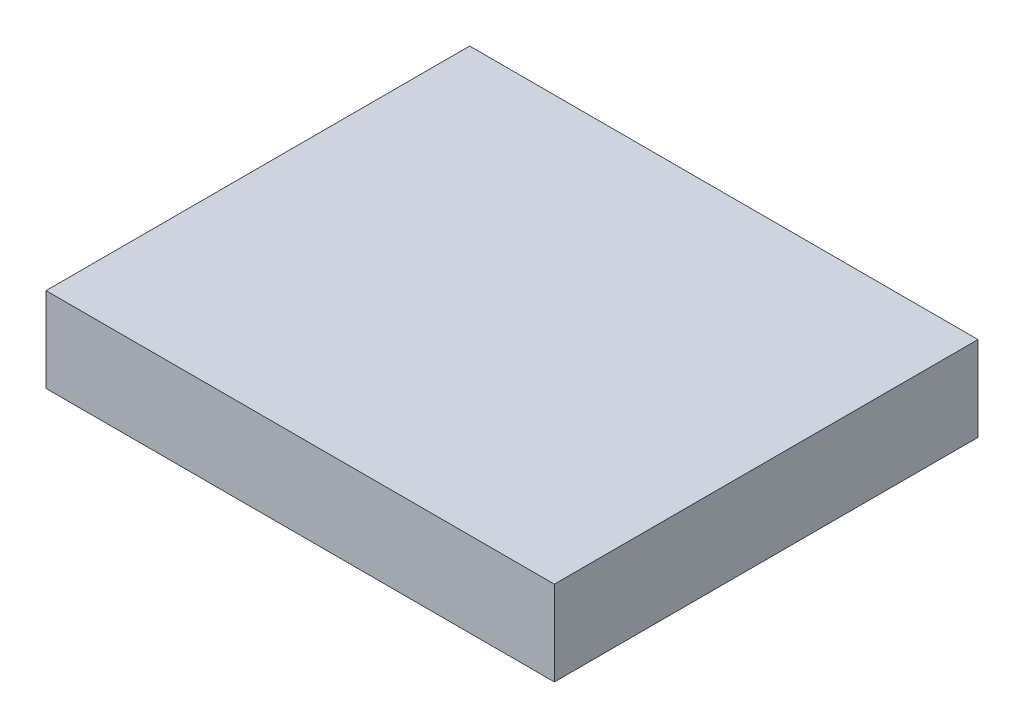
ISO-10303-21;
HEADER;
FILE_DESCRIPTION(('STEP AP214'),'2;1');
FILE_NAME('part.step','',(''),(''),'','','');
FILE_SCHEMA(('AUTOMOTIVE_DESIGN { 1 0 10303 214 1 1 1 1 }'));
ENDSEC;
DATA;
#1=APPLICATION_CONTEXT('core data for automotive mechanical design processes');
#2=APPLICATION_PROTOCOL_DEFINITION('international standard','automotive_design',2000,#1);
#3=PRODUCT_CONTEXT('',#1,'mechanical');
#4=PRODUCT('Part','Part','',(#3));
#5=PRODUCT_RELATED_PRODUCT_CATEGORY('part','',(#4));
#6=PRODUCT_DEFINITION_FORMATION('','',#4);
#7=PRODUCT_DEFINITION_CONTEXT('part definition',#1,'design');
#8=PRODUCT_DEFINITION('design','',#6,#7);
#9=PRODUCT_DEFINITION_SHAPE('','',#8);
#10=(LENGTH_UNIT() NAMED_UNIT(*) SI_UNIT(.MILLI.,.METRE.));
#11=(NAMED_UNIT(*) PLANE_ANGLE_UNIT() SI_UNIT($,.RADIAN.));
#12=(NAMED_UNIT(*) SI_UNIT($,.STERADIAN.) SOLID_ANGLE_UNIT());
#13=UNCERTAINTY_MEASURE_WITH_UNIT(LENGTH_MEASURE(1.E-05),#10,'distance_accuracy_value','');
#14=(GEOMETRIC_REPRESENTATION_CONTEXT(3) GLOBAL_UNCERTAINTY_ASSIGNED_CONTEXT((#13)) GLOBAL_UNIT_ASSIGNED_CONTEXT((#10,
#11,#12)) REPRESENTATION_CONTEXT('',''));
#15=CARTESIAN_POINT('',(0.,0.,0.));
#16=DIRECTION('',(0.,0.,1.));
#17=DIRECTION('',(1.,0.,0.));
#18=AXIS2_PLACEMENT_3D('',#15,#16,#17);
#19=CARTESIAN_POINT('',(0.,5.,0.));
#20=DIRECTION('',(1.,0.,0.));
#21=DIRECTION('',(0.,0.,-1.));
#22=AXIS2_PLACEMENT_3D('',#19,#20,#21);
#23=PLANE('',#22);
#24=DIRECTION('',(0.,0.,1.));
#25=VECTOR('',#24,1.);
#26=CARTESIAN_POINT('',(0.,0.,0.));
#27=LINE('',#26,#25);
#28=CARTESIAN_POINT('',(0.,0.,-25.));
#29=VERTEX_POINT('',#28);
#30=CARTESIAN_POINT('',(0.,0.,0.));
#31=VERTEX_POINT('',#30);
#32=EDGE_CURVE('E99',#29,#31,#27,.T.);
#33=ORIENTED_EDGE('',*,*,#32,.T.);
#34=DIRECTION('',(0.,-1.,0.));
#35=VECTOR('',#34,1.);
#36=CARTESIAN_POINT('',(0.,5.,0.));
#37=LINE('',#36,#35);
#38=CARTESIAN_POINT('',(0.,5.,0.));
#39=VERTEX_POINT('',#38);
#40=EDGE_CURVE('E11',#39,#31,#37,.T.);
#41=ORIENTED_EDGE('',*,*,#40,.F.);
#42=DIRECTION('',(0.,0.,1.));
#43=VECTOR('',#42,1.);
#44=CARTESIAN_POINT('',(0.,5.,0.));
#45=LINE('',#44,#43);
#46=CARTESIAN_POINT('',(0.,5.,-25.));
#47=VERTEX_POINT('',#46);
#48=EDGE_CURVE('E87',#47,#39,#45,.T.);
#49=ORIENTED_EDGE('',*,*,#48,.F.);
#50=DIRECTION('',(0.,-1.,0.));
#51=VECTOR('',#50,1.);
#52=CARTESIAN_POINT('',(0.,5.,-25.));
#53=LINE('',#52,#51);
#54=EDGE_CURVE('E95',#47,#29,#53,.T.);
#55=ORIENTED_EDGE('',*,*,#54,.T.);
#56=EDGE_LOOP('',(#33,#41,#49,#55));
#57=FACE_BOUND('',#56,.T.);
#58=ADVANCED_FACE('F36',(#57),#23,.F.);
#59=CARTESIAN_POINT('',(0.,5.,0.));
#60=DIRECTION('',(0.,0.,-1.));
#61=DIRECTION('',(-1.,0.,0.));
#62=AXIS2_PLACEMENT_3D('',#59,#60,#61);
#63=PLANE('',#62);
#64=DIRECTION('',(1.,0.,0.));
#65=VECTOR('',#64,1.);
#66=CARTESIAN_POINT('',(0.,0.,0.));
#67=LINE('',#66,#65);
#68=CARTESIAN_POINT('',(30.,0.,0.));
#69=VERTEX_POINT('',#68);
#70=EDGE_CURVE('E91',#31,#69,#67,.T.);
#71=ORIENTED_EDGE('',*,*,#70,.T.);
#72=DIRECTION('',(0.,-1.,0.));
#73=VECTOR('',#72,1.);
#74=CARTESIAN_POINT('',(30.,5.,0.));
#75=LINE('',#74,#73);
#76=CARTESIAN_POINT('',(30.,5.,0.));
#77=VERTEX_POINT('',#76);
#78=EDGE_CURVE('E44',#77,#69,#75,.T.);
#79=ORIENTED_EDGE('',*,*,#78,.F.);
#80=DIRECTION('',(1.,0.,0.));
#81=VECTOR('',#80,1.);
#82=CARTESIAN_POINT('',(0.,5.,0.));
#83=LINE('',#82,#81);
#84=EDGE_CURVE('E82',#39,#77,#83,.T.);
#85=ORIENTED_EDGE('',*,*,#84,.F.);
#86=ORIENTED_EDGE('',*,*,#40,.T.);
#87=EDGE_LOOP('',(#71,#79,#85,#86));
#88=FACE_BOUND('',#87,.T.);
#89=ADVANCED_FACE('F90',(#88),#63,.F.);
#90=CARTESIAN_POINT('',(30.,5.,0.));
#91=DIRECTION('',(-1.,0.,0.));
#92=DIRECTION('',(0.,0.,1.));
#93=AXIS2_PLACEMENT_3D('',#90,#91,#92);
#94=PLANE('',#93);
#95=DIRECTION('',(0.,0.,-1.));
#96=VECTOR('',#95,1.);
#97=CARTESIAN_POINT('',(30.,0.,0.));
#98=LINE('',#97,#96);
#99=CARTESIAN_POINT('',(30.,0.,-25.));
#100=VERTEX_POINT('',#99);
#101=EDGE_CURVE('E69',#69,#100,#98,.T.);
#102=ORIENTED_EDGE('',*,*,#101,.T.);
#103=DIRECTION('',(0.,-1.,0.));
#104=VECTOR('',#103,1.);
#105=CARTESIAN_POINT('',(30.,5.,-25.));
#106=LINE('',#105,#104);
#107=CARTESIAN_POINT('',(30.,5.,-25.));
#108=VERTEX_POINT('',#107);
#109=EDGE_CURVE('E92',#108,#100,#106,.T.);
#110=ORIENTED_EDGE('',*,*,#109,.F.);
#111=DIRECTION('',(0.,0.,-1.));
#112=VECTOR('',#111,1.);
#113=CARTESIAN_POINT('',(30.,5.,0.));
#114=LINE('',#113,#112);
#115=EDGE_CURVE('E85',#77,#108,#114,.T.);
#116=ORIENTED_EDGE('',*,*,#115,.F.);
#117=ORIENTED_EDGE('',*,*,#78,.T.);
#118=EDGE_LOOP('',(#102,#110,#116,#117));
#119=FACE_BOUND('',#118,.T.);
#120=ADVANCED_FACE('F93',(#119),#94,.F.);
#121=CARTESIAN_POINT('',(0.,5.,-25.));
#122=DIRECTION('',(0.,0.,1.));
#123=DIRECTION('',(1.,0.,0.));
#124=AXIS2_PLACEMENT_3D('',#121,#122,#123);
#125=PLANE('',#124);
#126=DIRECTION('',(-1.,0.,0.));
#127=VECTOR('',#126,1.);
#128=CARTESIAN_POINT('',(0.,0.,-25.));
#129=LINE('',#128,#127);
#130=EDGE_CURVE('E75',#100,#29,#129,.T.);
#131=ORIENTED_EDGE('',*,*,#130,.T.);
#132=ORIENTED_EDGE('',*,*,#54,.F.);
#133=DIRECTION('',(-1.,0.,0.));
#134=VECTOR('',#133,1.);
#135=CARTESIAN_POINT('',(0.,5.,-25.));
#136=LINE('',#135,#134);
#137=EDGE_CURVE('E52',#108,#47,#136,.T.);
#138=ORIENTED_EDGE('',*,*,#137,.F.);
#139=ORIENTED_EDGE('',*,*,#109,.T.);
#140=EDGE_LOOP('',(#131,#132,#138,#139));
#141=FACE_BOUND('',#140,.T.);
#142=ADVANCED_FACE('F106',(#141),#125,.F.);
#143=CARTESIAN_POINT('',(0.,5.,0.));
#144=DIRECTION('',(0.,-1.,0.));
#145=DIRECTION('',(0.,0.,-1.));
#146=AXIS2_PLACEMENT_3D('',#143,#144,#145);
#147=PLANE('',#146);
#148=ORIENTED_EDGE('',*,*,#48,.T.);
#149=ORIENTED_EDGE('',*,*,#84,.T.);
#150=ORIENTED_EDGE('',*,*,#115,.T.);
#151=ORIENTED_EDGE('',*,*,#137,.T.);
#152=EDGE_LOOP('',(#148,#149,#150,#151));
#153=FACE_BOUND('',#152,.T.);
#154=ADVANCED_FACE('F83',(#153),#147,.F.);
#155=CARTESIAN_POINT('',(0.,0.,0.));
#156=DIRECTION('',(0.,-1.,0.));
#157=DIRECTION('',(0.,0.,-1.));
#158=AXIS2_PLACEMENT_3D('',#155,#156,#157);
#159=PLANE('',#158);
#160=ORIENTED_EDGE('',*,*,#32,.F.);
#161=ORIENTED_EDGE('',*,*,#130,.F.);
#162=ORIENTED_EDGE('',*,*,#101,.F.);
#163=ORIENTED_EDGE('',*,*,#70,.F.);
#164=EDGE_LOOP('',(#160,#161,#162,#163));
#165=FACE_BOUND('',#164,.T.);
#166=ADVANCED_FACE('F109',(#165),#159,.T.);
#167=CLOSED_SHELL('',(#58,#89,#120,#142,#154,#166));
#168=MANIFOLD_SOLID_BREP('B2',#167);
#169=ADVANCED_BREP_SHAPE_REPRESENTATION('',(#18,#168),#14);
#170=SHAPE_DEFINITION_REPRESENTATION(#9,#169);
ENDSEC;
END-ISO-10303-21;
